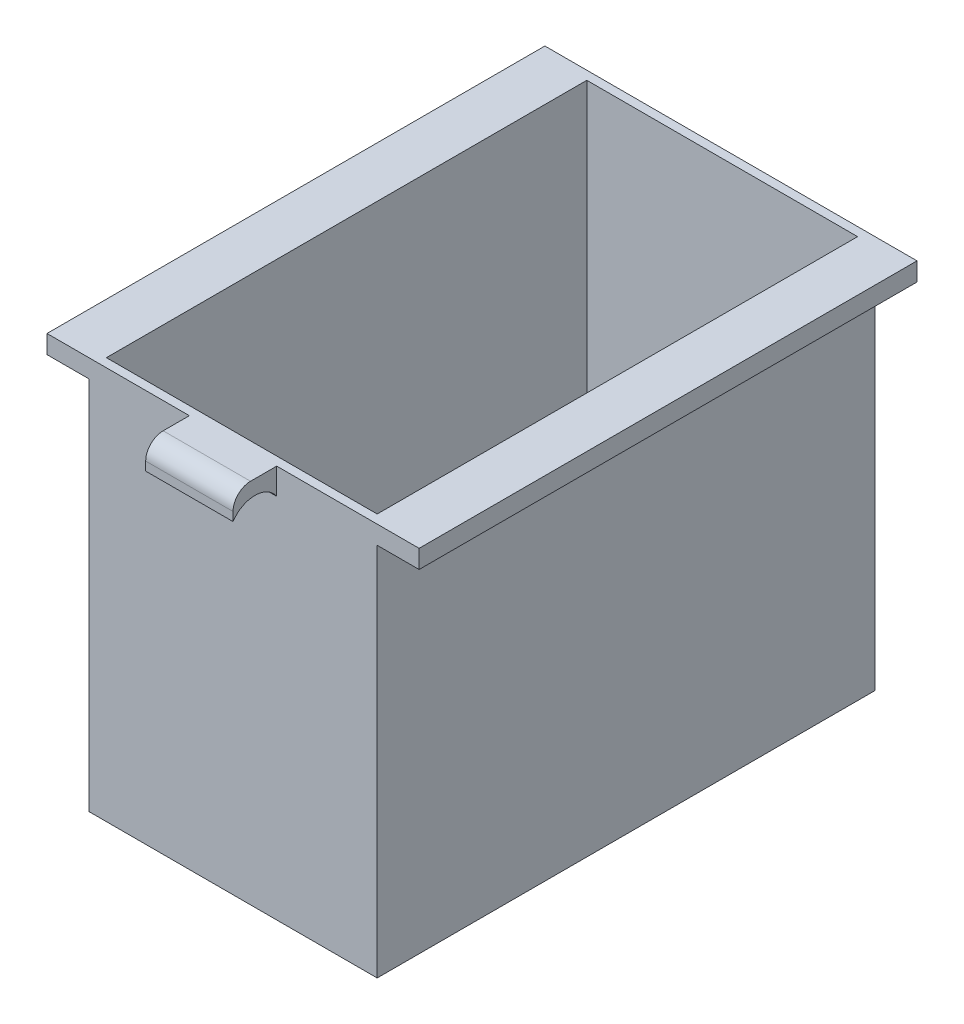
ISO-10303-21;
HEADER;
FILE_DESCRIPTION(('STEP AP214'),'2;1');
FILE_NAME('part.step','',(''),(''),'','','');
FILE_SCHEMA(('AUTOMOTIVE_DESIGN { 1 0 10303 214 1 1 1 1 }'));
ENDSEC;
DATA;
#1=APPLICATION_CONTEXT('core data for automotive mechanical design processes');
#2=APPLICATION_PROTOCOL_DEFINITION('international standard','automotive_design',2000,#1);
#3=PRODUCT_CONTEXT('',#1,'mechanical');
#4=PRODUCT('Part','Part','',(#3));
#5=PRODUCT_RELATED_PRODUCT_CATEGORY('part','',(#4));
#6=PRODUCT_DEFINITION_FORMATION('','',#4);
#7=PRODUCT_DEFINITION_CONTEXT('part definition',#1,'design');
#8=PRODUCT_DEFINITION('design','',#6,#7);
#9=PRODUCT_DEFINITION_SHAPE('','',#8);
#10=(LENGTH_UNIT() NAMED_UNIT(*) SI_UNIT(.MILLI.,.METRE.));
#11=(NAMED_UNIT(*) PLANE_ANGLE_UNIT() SI_UNIT($,.RADIAN.));
#12=(NAMED_UNIT(*) SI_UNIT($,.STERADIAN.) SOLID_ANGLE_UNIT());
#13=UNCERTAINTY_MEASURE_WITH_UNIT(LENGTH_MEASURE(1.E-05),#10,'distance_accuracy_value','');
#14=(GEOMETRIC_REPRESENTATION_CONTEXT(3) GLOBAL_UNCERTAINTY_ASSIGNED_CONTEXT((#13)) GLOBAL_UNIT_ASSIGNED_CONTEXT((#10,
#11,#12)) REPRESENTATION_CONTEXT('',''));
#15=CARTESIAN_POINT('',(0.,0.,0.));
#16=DIRECTION('',(0.,0.,1.));
#17=DIRECTION('',(1.,0.,0.));
#18=AXIS2_PLACEMENT_3D('',#15,#16,#17);
#19=CARTESIAN_POINT('',(16.5,45.,28.5));
#20=DIRECTION('',(0.,0.,-1.));
#21=DIRECTION('',(-1.,0.,0.));
#22=AXIS2_PLACEMENT_3D('',#19,#20,#21);
#23=PLANE('',#22);
#24=DIRECTION('',(0.,-1.,0.));
#25=VECTOR('',#24,1.);
#26=CARTESIAN_POINT('',(-5.00000000000001,45.,28.5));
#27=LINE('',#26,#25);
#28=CARTESIAN_POINT('',(-5.,45.,28.5));
#29=VERTEX_POINT('',#28);
#30=CARTESIAN_POINT('',(-5.00000000000001,42.,28.5));
#31=VERTEX_POINT('',#30);
#32=EDGE_CURVE('E172',#29,#31,#27,.T.);
#33=ORIENTED_EDGE('',*,*,#32,.F.);
#34=DIRECTION('',(1.,0.,0.));
#35=VECTOR('',#34,1.);
#36=CARTESIAN_POINT('',(16.5,45.,28.5));
#37=LINE('',#36,#35);
#38=CARTESIAN_POINT('',(-21.3,45.,28.5));
#39=VERTEX_POINT('',#38);
#40=EDGE_CURVE('E263',#39,#29,#37,.T.);
#41=ORIENTED_EDGE('',*,*,#40,.F.);
#42=DIRECTION('',(0.,1.,0.));
#43=VECTOR('',#42,1.);
#44=CARTESIAN_POINT('',(-21.3,45.,28.5));
#45=LINE('',#44,#43);
#46=CARTESIAN_POINT('',(-21.3,42.9,28.5));
#47=VERTEX_POINT('',#46);
#48=EDGE_CURVE('E218',#47,#39,#45,.T.);
#49=ORIENTED_EDGE('',*,*,#48,.F.);
#50=DIRECTION('',(1.,0.,0.));
#51=VECTOR('',#50,1.);
#52=CARTESIAN_POINT('',(-21.3,42.9,28.5));
#53=LINE('',#52,#51);
#54=CARTESIAN_POINT('',(-16.5,42.9,28.5));
#55=VERTEX_POINT('',#54);
#56=EDGE_CURVE('E224',#47,#55,#53,.T.);
#57=ORIENTED_EDGE('',*,*,#56,.T.);
#58=DIRECTION('',(0.,-1.,0.));
#59=VECTOR('',#58,1.);
#60=CARTESIAN_POINT('',(-16.5,45.,28.5));
#61=LINE('',#60,#59);
#62=CARTESIAN_POINT('',(-16.5,0.,28.5));
#63=VERTEX_POINT('',#62);
#64=EDGE_CURVE('E285',#55,#63,#61,.T.);
#65=ORIENTED_EDGE('',*,*,#64,.T.);
#66=DIRECTION('',(1.,0.,0.));
#67=VECTOR('',#66,1.);
#68=CARTESIAN_POINT('',(16.5,0.,28.5));
#69=LINE('',#68,#67);
#70=CARTESIAN_POINT('',(16.5,0.,28.5));
#71=VERTEX_POINT('',#70);
#72=EDGE_CURVE('E271',#63,#71,#69,.T.);
#73=ORIENTED_EDGE('',*,*,#72,.T.);
#74=DIRECTION('',(0.,-1.,0.));
#75=VECTOR('',#74,1.);
#76=CARTESIAN_POINT('',(16.5,45.,28.5));
#77=LINE('',#76,#75);
#78=CARTESIAN_POINT('',(16.5,42.9,28.5));
#79=VERTEX_POINT('',#78);
#80=EDGE_CURVE('E283',#79,#71,#77,.T.);
#81=ORIENTED_EDGE('',*,*,#80,.F.);
#82=DIRECTION('',(-1.,0.,0.));
#83=VECTOR('',#82,1.);
#84=CARTESIAN_POINT('',(21.3,42.9,28.5));
#85=LINE('',#84,#83);
#86=CARTESIAN_POINT('',(21.3,42.9,28.5));
#87=VERTEX_POINT('',#86);
#88=EDGE_CURVE('E210',#87,#79,#85,.T.);
#89=ORIENTED_EDGE('',*,*,#88,.F.);
#90=DIRECTION('',(0.,1.,0.));
#91=VECTOR('',#90,1.);
#92=CARTESIAN_POINT('',(21.3,45.,28.5));
#93=LINE('',#92,#91);
#94=CARTESIAN_POINT('',(21.3,45.,28.5));
#95=VERTEX_POINT('',#94);
#96=EDGE_CURVE('E201',#87,#95,#93,.T.);
#97=ORIENTED_EDGE('',*,*,#96,.T.);
#98=CARTESIAN_POINT('',(4.99999999999999,45.,28.5));
#99=VERTEX_POINT('',#98);
#100=EDGE_CURVE('E183',#99,#95,#37,.T.);
#101=ORIENTED_EDGE('',*,*,#100,.F.);
#102=DIRECTION('',(0.,1.,0.));
#103=VECTOR('',#102,1.);
#104=CARTESIAN_POINT('',(4.99999999999999,45.,28.5));
#105=LINE('',#104,#103);
#106=CARTESIAN_POINT('',(4.99999999999999,42.,28.5));
#107=VERTEX_POINT('',#106);
#108=EDGE_CURVE('E171',#107,#99,#105,.T.);
#109=ORIENTED_EDGE('',*,*,#108,.F.);
#110=DIRECTION('',(1.,0.,0.));
#111=VECTOR('',#110,1.);
#112=CARTESIAN_POINT('',(-5.00000000000001,42.,28.5));
#113=LINE('',#112,#111);
#114=EDGE_CURVE('E159',#31,#107,#113,.T.);
#115=ORIENTED_EDGE('',*,*,#114,.F.);
#116=EDGE_LOOP('',(#33,#41,#49,#57,#65,#73,#81,#89,#97,#101,#109,#115));
#117=FACE_BOUND('',#116,.T.);
#118=ADVANCED_FACE('F43',(#117),#23,.F.);
#119=CARTESIAN_POINT('',(-16.5,45.,28.5));
#120=DIRECTION('',(1.,0.,0.));
#121=DIRECTION('',(0.,0.,-1.));
#122=AXIS2_PLACEMENT_3D('',#119,#120,#121);
#123=PLANE('',#122);
#124=DIRECTION('',(0.,0.,1.));
#125=VECTOR('',#124,1.);
#126=CARTESIAN_POINT('',(-16.5,42.9,-28.5));
#127=LINE('',#126,#125);
#128=CARTESIAN_POINT('',(-16.5,42.9,-28.5));
#129=VERTEX_POINT('',#128);
#130=EDGE_CURVE('E212',#129,#55,#127,.T.);
#131=ORIENTED_EDGE('',*,*,#130,.F.);
#132=DIRECTION('',(0.,-1.,0.));
#133=VECTOR('',#132,1.);
#134=CARTESIAN_POINT('',(-16.5,45.,-28.5));
#135=LINE('',#134,#133);
#136=CARTESIAN_POINT('',(-16.5,0.,-28.5));
#137=VERTEX_POINT('',#136);
#138=EDGE_CURVE('E268',#129,#137,#135,.T.);
#139=ORIENTED_EDGE('',*,*,#138,.T.);
#140=DIRECTION('',(0.,0.,1.));
#141=VECTOR('',#140,1.);
#142=CARTESIAN_POINT('',(-16.5,0.,28.5));
#143=LINE('',#142,#141);
#144=EDGE_CURVE('E239',#137,#63,#143,.T.);
#145=ORIENTED_EDGE('',*,*,#144,.T.);
#146=ORIENTED_EDGE('',*,*,#64,.F.);
#147=EDGE_LOOP('',(#131,#139,#145,#146));
#148=FACE_BOUND('',#147,.T.);
#149=ADVANCED_FACE('F321',(#148),#123,.F.);
#150=CARTESIAN_POINT('',(16.5,45.,28.5));
#151=DIRECTION('',(-1.,0.,0.));
#152=DIRECTION('',(0.,0.,1.));
#153=AXIS2_PLACEMENT_3D('',#150,#151,#152);
#154=PLANE('',#153);
#155=DIRECTION('',(0.,-1.,0.));
#156=VECTOR('',#155,1.);
#157=CARTESIAN_POINT('',(16.5,45.,-28.5));
#158=LINE('',#157,#156);
#159=CARTESIAN_POINT('',(16.5,42.9,-28.5));
#160=VERTEX_POINT('',#159);
#161=CARTESIAN_POINT('',(16.5,0.,-28.5));
#162=VERTEX_POINT('',#161);
#163=EDGE_CURVE('E281',#160,#162,#158,.T.);
#164=ORIENTED_EDGE('',*,*,#163,.F.);
#165=DIRECTION('',(0.,0.,1.));
#166=VECTOR('',#165,1.);
#167=CARTESIAN_POINT('',(16.5,42.9,-28.5));
#168=LINE('',#167,#166);
#169=EDGE_CURVE('E194',#160,#79,#168,.T.);
#170=ORIENTED_EDGE('',*,*,#169,.T.);
#171=ORIENTED_EDGE('',*,*,#80,.T.);
#172=DIRECTION('',(0.,0.,-1.));
#173=VECTOR('',#172,1.);
#174=CARTESIAN_POINT('',(16.5,0.,28.5));
#175=LINE('',#174,#173);
#176=EDGE_CURVE('E274',#71,#162,#175,.T.);
#177=ORIENTED_EDGE('',*,*,#176,.T.);
#178=EDGE_LOOP('',(#164,#170,#171,#177));
#179=FACE_BOUND('',#178,.T.);
#180=ADVANCED_FACE('F325',(#179),#154,.F.);
#181=CARTESIAN_POINT('',(16.5,45.,-28.5));
#182=DIRECTION('',(0.,0.,1.));
#183=DIRECTION('',(1.,0.,0.));
#184=AXIS2_PLACEMENT_3D('',#181,#182,#183);
#185=PLANE('',#184);
#186=DIRECTION('',(-1.,0.,0.));
#187=VECTOR('',#186,1.);
#188=CARTESIAN_POINT('',(16.5,0.,-28.5));
#189=LINE('',#188,#187);
#190=EDGE_CURVE('E277',#162,#137,#189,.T.);
#191=ORIENTED_EDGE('',*,*,#190,.T.);
#192=ORIENTED_EDGE('',*,*,#138,.F.);
#193=DIRECTION('',(1.,0.,0.));
#194=VECTOR('',#193,1.);
#195=CARTESIAN_POINT('',(-21.3,42.9,-28.5));
#196=LINE('',#195,#194);
#197=CARTESIAN_POINT('',(-21.3,42.9,-28.5));
#198=VERTEX_POINT('',#197);
#199=EDGE_CURVE('E229',#198,#129,#196,.T.);
#200=ORIENTED_EDGE('',*,*,#199,.F.);
#201=DIRECTION('',(0.,-1.,0.));
#202=VECTOR('',#201,1.);
#203=CARTESIAN_POINT('',(-21.3,45.,-28.5));
#204=LINE('',#203,#202);
#205=CARTESIAN_POINT('',(-21.3,45.,-28.5));
#206=VERTEX_POINT('',#205);
#207=EDGE_CURVE('E213',#206,#198,#204,.T.);
#208=ORIENTED_EDGE('',*,*,#207,.F.);
#209=DIRECTION('',(-1.,0.,0.));
#210=VECTOR('',#209,1.);
#211=CARTESIAN_POINT('',(16.5,45.,-28.5));
#212=LINE('',#211,#210);
#213=CARTESIAN_POINT('',(21.3,45.,-28.5));
#214=VERTEX_POINT('',#213);
#215=EDGE_CURVE('E266',#214,#206,#212,.T.);
#216=ORIENTED_EDGE('',*,*,#215,.F.);
#217=DIRECTION('',(0.,-1.,0.));
#218=VECTOR('',#217,1.);
#219=CARTESIAN_POINT('',(21.3,45.,-28.5));
#220=LINE('',#219,#218);
#221=CARTESIAN_POINT('',(21.3,42.9,-28.5));
#222=VERTEX_POINT('',#221);
#223=EDGE_CURVE('E195',#214,#222,#220,.T.);
#224=ORIENTED_EDGE('',*,*,#223,.T.);
#225=DIRECTION('',(-1.,0.,0.));
#226=VECTOR('',#225,1.);
#227=CARTESIAN_POINT('',(21.3,42.9,-28.5));
#228=LINE('',#227,#226);
#229=EDGE_CURVE('E206',#222,#160,#228,.T.);
#230=ORIENTED_EDGE('',*,*,#229,.T.);
#231=ORIENTED_EDGE('',*,*,#163,.T.);
#232=EDGE_LOOP('',(#191,#192,#200,#208,#216,#224,#230,#231));
#233=FACE_BOUND('',#232,.T.);
#234=ADVANCED_FACE('F307',(#233),#185,.F.);
#235=CARTESIAN_POINT('',(0.,45.,0.));
#236=DIRECTION('',(0.,1.,0.));
#237=DIRECTION('',(0.,0.,1.));
#238=AXIS2_PLACEMENT_3D('',#235,#236,#237);
#239=PLANE('',#238);
#240=DIRECTION('',(0.,0.,1.));
#241=VECTOR('',#240,1.);
#242=CARTESIAN_POINT('',(-15.5,45.,28.5));
#243=LINE('',#242,#241);
#244=CARTESIAN_POINT('',(-15.5,45.,-27.5));
#245=VERTEX_POINT('',#244);
#246=CARTESIAN_POINT('',(-15.5,45.,27.5));
#247=VERTEX_POINT('',#246);
#248=EDGE_CURVE('E255',#245,#247,#243,.T.);
#249=ORIENTED_EDGE('',*,*,#248,.F.);
#250=DIRECTION('',(-1.,0.,0.));
#251=VECTOR('',#250,1.);
#252=CARTESIAN_POINT('',(16.5,45.,-27.5));
#253=LINE('',#252,#251);
#254=CARTESIAN_POINT('',(15.5,45.,-27.5));
#255=VERTEX_POINT('',#254);
#256=EDGE_CURVE('E245',#255,#245,#253,.T.);
#257=ORIENTED_EDGE('',*,*,#256,.F.);
#258=DIRECTION('',(0.,0.,-1.));
#259=VECTOR('',#258,1.);
#260=CARTESIAN_POINT('',(15.5,45.,28.5));
#261=LINE('',#260,#259);
#262=CARTESIAN_POINT('',(15.5,45.,27.5));
#263=VERTEX_POINT('',#262);
#264=EDGE_CURVE('E259',#263,#255,#261,.T.);
#265=ORIENTED_EDGE('',*,*,#264,.F.);
#266=DIRECTION('',(1.,0.,0.));
#267=VECTOR('',#266,1.);
#268=CARTESIAN_POINT('',(16.5,45.,27.5));
#269=LINE('',#268,#267);
#270=EDGE_CURVE('E257',#247,#263,#269,.T.);
#271=ORIENTED_EDGE('',*,*,#270,.F.);
#272=EDGE_LOOP('',(#249,#257,#265,#271));
#273=FACE_BOUND('',#272,.T.);
#274=DIRECTION('',(0.,0.,-1.));
#275=VECTOR('',#274,1.);
#276=CARTESIAN_POINT('',(-5.00000000000001,45.,33.5));
#277=LINE('',#276,#275);
#278=CARTESIAN_POINT('',(-5.00000000000001,45.,31.5));
#279=VERTEX_POINT('',#278);
#280=EDGE_CURVE('E190',#279,#29,#277,.T.);
#281=ORIENTED_EDGE('',*,*,#280,.F.);
#282=DIRECTION('',(-1.,0.,0.));
#283=VECTOR('',#282,1.);
#284=CARTESIAN_POINT('',(0.,45.,31.5));
#285=LINE('',#284,#283);
#286=CARTESIAN_POINT('',(4.99999999999999,45.,31.5));
#287=VERTEX_POINT('',#286);
#288=EDGE_CURVE('E51',#279,#287,#285,.F.);
#289=ORIENTED_EDGE('',*,*,#288,.T.);
#290=DIRECTION('',(0.,0.,-1.));
#291=VECTOR('',#290,1.);
#292=CARTESIAN_POINT('',(4.99999999999999,45.,33.5));
#293=LINE('',#292,#291);
#294=EDGE_CURVE('E192',#287,#99,#293,.T.);
#295=ORIENTED_EDGE('',*,*,#294,.T.);
#296=ORIENTED_EDGE('',*,*,#100,.T.);
#297=DIRECTION('',(0.,0.,-1.));
#298=VECTOR('',#297,1.);
#299=CARTESIAN_POINT('',(21.3,45.,-28.5));
#300=LINE('',#299,#298);
#301=EDGE_CURVE('E198',#95,#214,#300,.T.);
#302=ORIENTED_EDGE('',*,*,#301,.T.);
#303=ORIENTED_EDGE('',*,*,#215,.T.);
#304=DIRECTION('',(0.,0.,-1.));
#305=VECTOR('',#304,1.);
#306=CARTESIAN_POINT('',(-21.3,45.,-28.5));
#307=LINE('',#306,#305);
#308=EDGE_CURVE('E221',#39,#206,#307,.T.);
#309=ORIENTED_EDGE('',*,*,#308,.F.);
#310=ORIENTED_EDGE('',*,*,#40,.T.);
#311=EDGE_LOOP('',(#281,#289,#295,#296,#302,#303,#309,#310));
#312=FACE_BOUND('',#311,.T.);
#313=ADVANCED_FACE('F301',(#273,#312),#239,.T.);
#314=CARTESIAN_POINT('',(0.,0.,0.));
#315=DIRECTION('',(0.,1.,0.));
#316=DIRECTION('',(0.,0.,1.));
#317=AXIS2_PLACEMENT_3D('',#314,#315,#316);
#318=PLANE('',#317);
#319=ORIENTED_EDGE('',*,*,#144,.F.);
#320=ORIENTED_EDGE('',*,*,#190,.F.);
#321=ORIENTED_EDGE('',*,*,#176,.F.);
#322=ORIENTED_EDGE('',*,*,#72,.F.);
#323=EDGE_LOOP('',(#319,#320,#321,#322));
#324=FACE_BOUND('',#323,.T.);
#325=ADVANCED_FACE('F319',(#324),#318,.F.);
#326=CARTESIAN_POINT('',(-15.5,45.,28.5));
#327=DIRECTION('',(1.,0.,0.));
#328=DIRECTION('',(0.,0.,-1.));
#329=AXIS2_PLACEMENT_3D('',#326,#327,#328);
#330=PLANE('',#329);
#331=DIRECTION('',(0.,0.,1.));
#332=VECTOR('',#331,1.);
#333=CARTESIAN_POINT('',(-15.5,1.,28.5));
#334=LINE('',#333,#332);
#335=CARTESIAN_POINT('',(-15.5,1.,-27.5));
#336=VERTEX_POINT('',#335);
#337=CARTESIAN_POINT('',(-15.5,1.,27.5));
#338=VERTEX_POINT('',#337);
#339=EDGE_CURVE('E232',#336,#338,#334,.T.);
#340=ORIENTED_EDGE('',*,*,#339,.F.);
#341=DIRECTION('',(0.,-1.,0.));
#342=VECTOR('',#341,1.);
#343=CARTESIAN_POINT('',(-15.5,45.,-27.5));
#344=LINE('',#343,#342);
#345=EDGE_CURVE('E241',#245,#336,#344,.T.);
#346=ORIENTED_EDGE('',*,*,#345,.F.);
#347=ORIENTED_EDGE('',*,*,#248,.T.);
#348=DIRECTION('',(0.,-1.,0.));
#349=VECTOR('',#348,1.);
#350=CARTESIAN_POINT('',(-15.5,45.,27.5));
#351=LINE('',#350,#349);
#352=EDGE_CURVE('E236',#247,#338,#351,.T.);
#353=ORIENTED_EDGE('',*,*,#352,.T.);
#354=EDGE_LOOP('',(#340,#346,#347,#353));
#355=FACE_BOUND('',#354,.T.);
#356=ADVANCED_FACE('F352',(#355),#330,.T.);
#357=CARTESIAN_POINT('',(16.5,45.,27.5));
#358=DIRECTION('',(0.,0.,-1.));
#359=DIRECTION('',(-1.,0.,0.));
#360=AXIS2_PLACEMENT_3D('',#357,#358,#359);
#361=PLANE('',#360);
#362=DIRECTION('',(1.,0.,0.));
#363=VECTOR('',#362,1.);
#364=CARTESIAN_POINT('',(16.5,1.,27.5));
#365=LINE('',#364,#363);
#366=CARTESIAN_POINT('',(15.5,1.,27.5));
#367=VERTEX_POINT('',#366);
#368=EDGE_CURVE('E235',#338,#367,#365,.T.);
#369=ORIENTED_EDGE('',*,*,#368,.F.);
#370=ORIENTED_EDGE('',*,*,#352,.F.);
#371=ORIENTED_EDGE('',*,*,#270,.T.);
#372=DIRECTION('',(0.,-1.,0.));
#373=VECTOR('',#372,1.);
#374=CARTESIAN_POINT('',(15.5,45.,27.5));
#375=LINE('',#374,#373);
#376=EDGE_CURVE('E240',#263,#367,#375,.T.);
#377=ORIENTED_EDGE('',*,*,#376,.T.);
#378=EDGE_LOOP('',(#369,#370,#371,#377));
#379=FACE_BOUND('',#378,.T.);
#380=ADVANCED_FACE('F367',(#379),#361,.T.);
#381=CARTESIAN_POINT('',(15.5,45.,28.5));
#382=DIRECTION('',(-1.,0.,0.));
#383=DIRECTION('',(0.,0.,1.));
#384=AXIS2_PLACEMENT_3D('',#381,#382,#383);
#385=PLANE('',#384);
#386=DIRECTION('',(0.,0.,-1.));
#387=VECTOR('',#386,1.);
#388=CARTESIAN_POINT('',(15.5,1.,28.5));
#389=LINE('',#388,#387);
#390=CARTESIAN_POINT('',(15.5,1.,-27.5));
#391=VERTEX_POINT('',#390);
#392=EDGE_CURVE('E247',#367,#391,#389,.T.);
#393=ORIENTED_EDGE('',*,*,#392,.F.);
#394=ORIENTED_EDGE('',*,*,#376,.F.);
#395=ORIENTED_EDGE('',*,*,#264,.T.);
#396=DIRECTION('',(0.,-1.,0.));
#397=VECTOR('',#396,1.);
#398=CARTESIAN_POINT('',(15.5,45.,-27.5));
#399=LINE('',#398,#397);
#400=EDGE_CURVE('E244',#255,#391,#399,.T.);
#401=ORIENTED_EDGE('',*,*,#400,.T.);
#402=EDGE_LOOP('',(#393,#394,#395,#401));
#403=FACE_BOUND('',#402,.T.);
#404=ADVANCED_FACE('F363',(#403),#385,.T.);
#405=CARTESIAN_POINT('',(16.5,45.,-27.5));
#406=DIRECTION('',(0.,0.,1.));
#407=DIRECTION('',(1.,0.,0.));
#408=AXIS2_PLACEMENT_3D('',#405,#406,#407);
#409=PLANE('',#408);
#410=DIRECTION('',(-1.,0.,0.));
#411=VECTOR('',#410,1.);
#412=CARTESIAN_POINT('',(16.5,1.,-27.5));
#413=LINE('',#412,#411);
#414=EDGE_CURVE('E251',#391,#336,#413,.T.);
#415=ORIENTED_EDGE('',*,*,#414,.F.);
#416=ORIENTED_EDGE('',*,*,#400,.F.);
#417=ORIENTED_EDGE('',*,*,#256,.T.);
#418=ORIENTED_EDGE('',*,*,#345,.T.);
#419=EDGE_LOOP('',(#415,#416,#417,#418));
#420=FACE_BOUND('',#419,.T.);
#421=ADVANCED_FACE('F359',(#420),#409,.T.);
#422=CARTESIAN_POINT('',(0.,1.,0.));
#423=DIRECTION('',(0.,1.,0.));
#424=DIRECTION('',(0.,0.,1.));
#425=AXIS2_PLACEMENT_3D('',#422,#423,#424);
#426=PLANE('',#425);
#427=ORIENTED_EDGE('',*,*,#339,.T.);
#428=ORIENTED_EDGE('',*,*,#368,.T.);
#429=ORIENTED_EDGE('',*,*,#392,.T.);
#430=ORIENTED_EDGE('',*,*,#414,.T.);
#431=EDGE_LOOP('',(#427,#428,#429,#430));
#432=FACE_BOUND('',#431,.T.);
#433=ADVANCED_FACE('F356',(#432),#426,.T.);
#434=CARTESIAN_POINT('',(-21.3,42.9,-28.5));
#435=DIRECTION('',(0.,1.,0.));
#436=DIRECTION('',(0.,0.,1.));
#437=AXIS2_PLACEMENT_3D('',#434,#435,#436);
#438=PLANE('',#437);
#439=ORIENTED_EDGE('',*,*,#130,.T.);
#440=ORIENTED_EDGE('',*,*,#56,.F.);
#441=DIRECTION('',(0.,0.,1.));
#442=VECTOR('',#441,1.);
#443=CARTESIAN_POINT('',(-21.3,42.9,-28.5));
#444=LINE('',#443,#442);
#445=EDGE_CURVE('E216',#198,#47,#444,.T.);
#446=ORIENTED_EDGE('',*,*,#445,.F.);
#447=ORIENTED_EDGE('',*,*,#199,.T.);
#448=EDGE_LOOP('',(#439,#440,#446,#447));
#449=FACE_BOUND('',#448,.T.);
#450=ADVANCED_FACE('F311',(#449),#438,.F.);
#451=CARTESIAN_POINT('',(-21.3,0.,0.));
#452=DIRECTION('',(-1.,0.,0.));
#453=DIRECTION('',(0.,0.,1.));
#454=AXIS2_PLACEMENT_3D('',#451,#452,#453);
#455=PLANE('',#454);
#456=ORIENTED_EDGE('',*,*,#207,.T.);
#457=ORIENTED_EDGE('',*,*,#445,.T.);
#458=ORIENTED_EDGE('',*,*,#48,.T.);
#459=ORIENTED_EDGE('',*,*,#308,.T.);
#460=EDGE_LOOP('',(#456,#457,#458,#459));
#461=FACE_BOUND('',#460,.T.);
#462=ADVANCED_FACE('F304',(#461),#455,.T.);
#463=CARTESIAN_POINT('',(21.3,42.9,-28.5));
#464=DIRECTION('',(0.,-1.,0.));
#465=DIRECTION('',(0.,0.,-1.));
#466=AXIS2_PLACEMENT_3D('',#463,#464,#465);
#467=PLANE('',#466);
#468=ORIENTED_EDGE('',*,*,#169,.F.);
#469=ORIENTED_EDGE('',*,*,#229,.F.);
#470=DIRECTION('',(0.,0.,1.));
#471=VECTOR('',#470,1.);
#472=CARTESIAN_POINT('',(21.3,42.9,-28.5));
#473=LINE('',#472,#471);
#474=EDGE_CURVE('E203',#222,#87,#473,.T.);
#475=ORIENTED_EDGE('',*,*,#474,.T.);
#476=ORIENTED_EDGE('',*,*,#88,.T.);
#477=EDGE_LOOP('',(#468,#469,#475,#476));
#478=FACE_BOUND('',#477,.T.);
#479=ADVANCED_FACE('F332',(#478),#467,.T.);
#480=CARTESIAN_POINT('',(21.3,0.,0.));
#481=DIRECTION('',(1.,0.,0.));
#482=DIRECTION('',(0.,0.,1.));
#483=AXIS2_PLACEMENT_3D('',#480,#481,#482);
#484=PLANE('',#483);
#485=ORIENTED_EDGE('',*,*,#223,.F.);
#486=ORIENTED_EDGE('',*,*,#301,.F.);
#487=ORIENTED_EDGE('',*,*,#96,.F.);
#488=ORIENTED_EDGE('',*,*,#474,.F.);
#489=EDGE_LOOP('',(#485,#486,#487,#488));
#490=FACE_BOUND('',#489,.T.);
#491=ADVANCED_FACE('F331',(#490),#484,.T.);
#492=CARTESIAN_POINT('',(-5.00000000000001,45.,33.5));
#493=DIRECTION('',(1.,0.,0.));
#494=DIRECTION('',(0.,0.,-1.));
#495=AXIS2_PLACEMENT_3D('',#492,#493,#494);
#496=PLANE('',#495);
#497=DIRECTION('',(0.,-1.,0.));
#498=VECTOR('',#497,1.);
#499=CARTESIAN_POINT('',(-5.00000000000001,45.,33.5));
#500=LINE('',#499,#498);
#501=CARTESIAN_POINT('',(-5.00000000000001,43.,33.5));
#502=VERTEX_POINT('',#501);
#503=CARTESIAN_POINT('',(-5.00000000000001,42.,33.5));
#504=VERTEX_POINT('',#503);
#505=EDGE_CURVE('E184',#502,#504,#500,.T.);
#506=ORIENTED_EDGE('',*,*,#505,.F.);
#507=CARTESIAN_POINT('',(-5.00000000000001,43.,31.5));
#508=DIRECTION('',(1.,0.,0.));
#509=DIRECTION('',(0.,0.,-1.));
#510=AXIS2_PLACEMENT_3D('',#507,#508,#509);
#511=CIRCLE('',#510,2.);
#512=EDGE_CURVE('E65',#502,#279,#511,.F.);
#513=ORIENTED_EDGE('',*,*,#512,.T.);
#514=ORIENTED_EDGE('',*,*,#280,.T.);
#515=ORIENTED_EDGE('',*,*,#32,.T.);
#516=CARTESIAN_POINT('',(-5.00000000000001,40.3416876048223,31.));
#517=DIRECTION('',(-1.,0.,0.));
#518=DIRECTION('',(0.,0.,-1.));
#519=AXIS2_PLACEMENT_3D('',#516,#517,#518);
#520=CIRCLE('',#519,3.);
#521=EDGE_CURVE('E166',#504,#31,#520,.T.);
#522=ORIENTED_EDGE('',*,*,#521,.F.);
#523=EDGE_LOOP('',(#506,#513,#514,#515,#522));
#524=FACE_BOUND('',#523,.T.);
#525=ADVANCED_FACE('F295',(#524),#496,.F.);
#526=CARTESIAN_POINT('',(4.99999999999999,45.,33.5));
#527=DIRECTION('',(-1.,0.,0.));
#528=DIRECTION('',(0.,0.,1.));
#529=AXIS2_PLACEMENT_3D('',#526,#527,#528);
#530=PLANE('',#529);
#531=ORIENTED_EDGE('',*,*,#294,.F.);
#532=CARTESIAN_POINT('',(4.99999999999999,43.,31.5));
#533=DIRECTION('',(-1.,0.,0.));
#534=DIRECTION('',(0.,0.,1.));
#535=AXIS2_PLACEMENT_3D('',#532,#533,#534);
#536=CIRCLE('',#535,2.);
#537=CARTESIAN_POINT('',(4.99999999999999,43.,33.5));
#538=VERTEX_POINT('',#537);
#539=EDGE_CURVE('E11',#287,#538,#536,.F.);
#540=ORIENTED_EDGE('',*,*,#539,.T.);
#541=DIRECTION('',(0.,1.,0.));
#542=VECTOR('',#541,1.);
#543=CARTESIAN_POINT('',(4.99999999999999,45.,33.5));
#544=LINE('',#543,#542);
#545=CARTESIAN_POINT('',(4.99999999999999,42.,33.5));
#546=VERTEX_POINT('',#545);
#547=EDGE_CURVE('E179',#546,#538,#544,.T.);
#548=ORIENTED_EDGE('',*,*,#547,.F.);
#549=CARTESIAN_POINT('',(4.99999999999999,40.3416876048223,31.));
#550=DIRECTION('',(-1.,0.,0.));
#551=DIRECTION('',(0.,0.,-1.));
#552=AXIS2_PLACEMENT_3D('',#549,#550,#551);
#553=CIRCLE('',#552,3.);
#554=EDGE_CURVE('E163',#546,#107,#553,.T.);
#555=ORIENTED_EDGE('',*,*,#554,.T.);
#556=ORIENTED_EDGE('',*,*,#108,.T.);
#557=EDGE_LOOP('',(#531,#540,#548,#555,#556));
#558=FACE_BOUND('',#557,.T.);
#559=ADVANCED_FACE('F177',(#558),#530,.F.);
#560=CARTESIAN_POINT('',(0.,0.,33.5));
#561=DIRECTION('',(0.,0.,1.));
#562=DIRECTION('',(1.,0.,0.));
#563=AXIS2_PLACEMENT_3D('',#560,#561,#562);
#564=PLANE('',#563);
#565=ORIENTED_EDGE('',*,*,#547,.T.);
#566=DIRECTION('',(-1.,0.,0.));
#567=VECTOR('',#566,1.);
#568=CARTESIAN_POINT('',(0.,43.,33.5));
#569=LINE('',#568,#567);
#570=EDGE_CURVE('E287',#538,#502,#569,.T.);
#571=ORIENTED_EDGE('',*,*,#570,.T.);
#572=ORIENTED_EDGE('',*,*,#505,.T.);
#573=DIRECTION('',(1.,0.,0.));
#574=VECTOR('',#573,1.);
#575=CARTESIAN_POINT('',(-5.00000000000001,42.,33.5));
#576=LINE('',#575,#574);
#577=EDGE_CURVE('E186',#504,#546,#576,.T.);
#578=ORIENTED_EDGE('',*,*,#577,.T.);
#579=EDGE_LOOP('',(#565,#571,#572,#578));
#580=FACE_BOUND('',#579,.T.);
#581=ADVANCED_FACE('F292',(#580),#564,.T.);
#582=CARTESIAN_POINT('',(4.99999999999999,40.3416876048223,31.));
#583=DIRECTION('',(-1.,0.,0.));
#584=DIRECTION('',(0.,0.,1.));
#585=AXIS2_PLACEMENT_3D('',#582,#583,#584);
#586=CYLINDRICAL_SURFACE('',#585,3.);
#587=ORIENTED_EDGE('',*,*,#521,.T.);
#588=ORIENTED_EDGE('',*,*,#114,.T.);
#589=ORIENTED_EDGE('',*,*,#554,.F.);
#590=ORIENTED_EDGE('',*,*,#577,.F.);
#591=EDGE_LOOP('',(#587,#588,#589,#590));
#592=FACE_BOUND('',#591,.T.);
#593=ADVANCED_FACE('F161',(#592),#586,.F.);
#594=CARTESIAN_POINT('',(0.,43.,31.5));
#595=DIRECTION('',(-1.,0.,0.));
#596=DIRECTION('',(0.,0.,1.));
#597=AXIS2_PLACEMENT_3D('',#594,#595,#596);
#598=CYLINDRICAL_SURFACE('',#597,2.);
#599=ORIENTED_EDGE('',*,*,#539,.F.);
#600=ORIENTED_EDGE('',*,*,#288,.F.);
#601=ORIENTED_EDGE('',*,*,#512,.F.);
#602=ORIENTED_EDGE('',*,*,#570,.F.);
#603=EDGE_LOOP('',(#599,#600,#601,#602));
#604=FACE_BOUND('',#603,.T.);
#605=ADVANCED_FACE('F45',(#604),#598,.T.);
#606=CLOSED_SHELL('',(#118,#149,#180,#234,#313,#325,#356,#380,#404,#421,#433,#450,#462,#479,
#491,#525,#559,#581,#593,#605));
#607=MANIFOLD_SOLID_BREP('B2',#606);
#608=ADVANCED_BREP_SHAPE_REPRESENTATION('',(#18,#607),#14);
#609=SHAPE_DEFINITION_REPRESENTATION(#9,#608);
ENDSEC;
END-ISO-10303-21;
